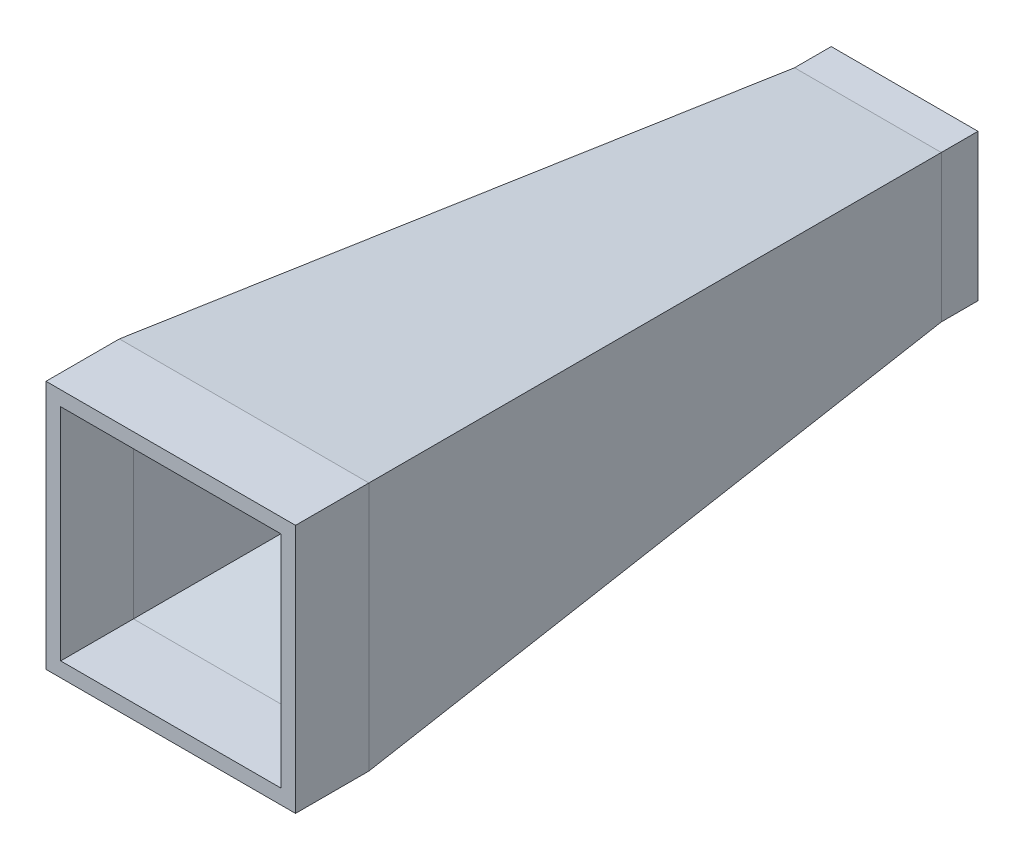
ISO-10303-21;
HEADER;
FILE_DESCRIPTION(('STEP AP214'),'2;1');
FILE_NAME('part.step','',(''),(''),'','','');
FILE_SCHEMA(('AUTOMOTIVE_DESIGN { 1 0 10303 214 1 1 1 1 }'));
ENDSEC;
DATA;
#1=APPLICATION_CONTEXT('core data for automotive mechanical design processes');
#2=APPLICATION_PROTOCOL_DEFINITION('international standard','automotive_design',2000,#1);
#3=PRODUCT_CONTEXT('',#1,'mechanical');
#4=PRODUCT('Part','Part','',(#3));
#5=PRODUCT_RELATED_PRODUCT_CATEGORY('part','',(#4));
#6=PRODUCT_DEFINITION_FORMATION('','',#4);
#7=PRODUCT_DEFINITION_CONTEXT('part definition',#1,'design');
#8=PRODUCT_DEFINITION('design','',#6,#7);
#9=PRODUCT_DEFINITION_SHAPE('','',#8);
#10=(LENGTH_UNIT() NAMED_UNIT(*) SI_UNIT(.MILLI.,.METRE.));
#11=(NAMED_UNIT(*) PLANE_ANGLE_UNIT() SI_UNIT($,.RADIAN.));
#12=(NAMED_UNIT(*) SI_UNIT($,.STERADIAN.) SOLID_ANGLE_UNIT());
#13=UNCERTAINTY_MEASURE_WITH_UNIT(LENGTH_MEASURE(1.E-05),#10,'distance_accuracy_value','');
#14=(GEOMETRIC_REPRESENTATION_CONTEXT(3) GLOBAL_UNCERTAINTY_ASSIGNED_CONTEXT((#13)) GLOBAL_UNIT_ASSIGNED_CONTEXT((#10,
#11,#12)) REPRESENTATION_CONTEXT('',''));
#15=CARTESIAN_POINT('',(0.,0.,0.));
#16=DIRECTION('',(0.,0.,1.));
#17=DIRECTION('',(1.,0.,0.));
#18=AXIS2_PLACEMENT_3D('',#15,#16,#17);
#19=CARTESIAN_POINT('',(0.,0.,50.));
#20=DIRECTION('',(0.,0.,-1.));
#21=DIRECTION('',(-1.,0.,0.));
#22=AXIS2_PLACEMENT_3D('',#19,#20,#21);
#23=PLANE('',#22);
#24=DIRECTION('',(0.,1.,0.));
#25=VECTOR('',#24,1.);
#26=CARTESIAN_POINT('',(85.,-85.,50.));
#27=LINE('',#26,#25);
#28=CARTESIAN_POINT('',(85.,-85.,50.));
#29=VERTEX_POINT('',#28);
#30=CARTESIAN_POINT('',(85.,85.,50.));
#31=VERTEX_POINT('',#30);
#32=EDGE_CURVE('E122',#29,#31,#27,.T.);
#33=ORIENTED_EDGE('',*,*,#32,.T.);
#34=DIRECTION('',(-1.,0.,0.));
#35=VECTOR('',#34,1.);
#36=CARTESIAN_POINT('',(-85.,85.,50.));
#37=LINE('',#36,#35);
#38=CARTESIAN_POINT('',(-85.,85.,50.));
#39=VERTEX_POINT('',#38);
#40=EDGE_CURVE('E115',#31,#39,#37,.T.);
#41=ORIENTED_EDGE('',*,*,#40,.T.);
#42=DIRECTION('',(0.,-1.,0.));
#43=VECTOR('',#42,1.);
#44=CARTESIAN_POINT('',(-85.,-85.,50.));
#45=LINE('',#44,#43);
#46=CARTESIAN_POINT('',(-85.,-85.,50.));
#47=VERTEX_POINT('',#46);
#48=EDGE_CURVE('E119',#39,#47,#45,.T.);
#49=ORIENTED_EDGE('',*,*,#48,.T.);
#50=DIRECTION('',(1.,0.,0.));
#51=VECTOR('',#50,1.);
#52=CARTESIAN_POINT('',(-85.,-85.,50.));
#53=LINE('',#52,#51);
#54=EDGE_CURVE('E77',#47,#29,#53,.T.);
#55=ORIENTED_EDGE('',*,*,#54,.T.);
#56=EDGE_LOOP('',(#33,#41,#49,#55));
#57=FACE_BOUND('',#56,.T.);
#58=DIRECTION('',(0.,1.,0.));
#59=VECTOR('',#58,1.);
#60=CARTESIAN_POINT('',(75.,0.,50.));
#61=LINE('',#60,#59);
#62=CARTESIAN_POINT('',(75.,-75.,50.));
#63=VERTEX_POINT('',#62);
#64=CARTESIAN_POINT('',(75.,75.,50.));
#65=VERTEX_POINT('',#64);
#66=EDGE_CURVE('E293',#63,#65,#61,.T.);
#67=ORIENTED_EDGE('',*,*,#66,.F.);
#68=DIRECTION('',(1.,0.,0.));
#69=VECTOR('',#68,1.);
#70=CARTESIAN_POINT('',(0.,-75.,50.));
#71=LINE('',#70,#69);
#72=CARTESIAN_POINT('',(-75.,-75.,50.));
#73=VERTEX_POINT('',#72);
#74=EDGE_CURVE('E283',#73,#63,#71,.T.);
#75=ORIENTED_EDGE('',*,*,#74,.F.);
#76=DIRECTION('',(0.,-1.,0.));
#77=VECTOR('',#76,1.);
#78=CARTESIAN_POINT('',(-75.,0.,50.));
#79=LINE('',#78,#77);
#80=CARTESIAN_POINT('',(-75.,75.,50.));
#81=VERTEX_POINT('',#80);
#82=EDGE_CURVE('E286',#81,#73,#79,.T.);
#83=ORIENTED_EDGE('',*,*,#82,.F.);
#84=DIRECTION('',(-1.,0.,0.));
#85=VECTOR('',#84,1.);
#86=CARTESIAN_POINT('',(0.,75.,50.));
#87=LINE('',#86,#85);
#88=EDGE_CURVE('E289',#65,#81,#87,.T.);
#89=ORIENTED_EDGE('',*,*,#88,.F.);
#90=EDGE_LOOP('',(#67,#75,#83,#89));
#91=FACE_BOUND('',#90,.T.);
#92=ADVANCED_FACE('F49',(#57,#91),#23,.F.);
#93=CARTESIAN_POINT('',(85.,-85.,50.));
#94=DIRECTION('',(-1.,0.,0.));
#95=DIRECTION('',(0.,0.,1.));
#96=AXIS2_PLACEMENT_3D('',#93,#94,#95);
#97=PLANE('',#96);
#98=DIRECTION('',(0.,1.,0.));
#99=VECTOR('',#98,1.);
#100=CARTESIAN_POINT('',(85.,-85.,0.));
#101=LINE('',#100,#99);
#102=CARTESIAN_POINT('',(85.,-85.,0.));
#103=VERTEX_POINT('',#102);
#104=CARTESIAN_POINT('',(85.,85.,0.));
#105=VERTEX_POINT('',#104);
#106=EDGE_CURVE('E98',#103,#105,#101,.T.);
#107=ORIENTED_EDGE('',*,*,#106,.T.);
#108=DIRECTION('',(0.,0.,-1.));
#109=VECTOR('',#108,1.);
#110=CARTESIAN_POINT('',(85.,85.,50.));
#111=LINE('',#110,#109);
#112=EDGE_CURVE('E12',#31,#105,#111,.T.);
#113=ORIENTED_EDGE('',*,*,#112,.F.);
#114=ORIENTED_EDGE('',*,*,#32,.F.);
#115=DIRECTION('',(0.,0.,-1.));
#116=VECTOR('',#115,1.);
#117=CARTESIAN_POINT('',(85.,-85.,50.));
#118=LINE('',#117,#116);
#119=EDGE_CURVE('E142',#29,#103,#118,.T.);
#120=ORIENTED_EDGE('',*,*,#119,.T.);
#121=EDGE_LOOP('',(#107,#113,#114,#120));
#122=FACE_BOUND('',#121,.T.);
#123=ADVANCED_FACE('F51',(#122),#97,.F.);
#124=CARTESIAN_POINT('',(-85.,85.,50.));
#125=DIRECTION('',(0.,-1.,0.));
#126=DIRECTION('',(0.,0.,-1.));
#127=AXIS2_PLACEMENT_3D('',#124,#125,#126);
#128=PLANE('',#127);
#129=DIRECTION('',(1.,0.,0.));
#130=VECTOR('',#129,1.);
#131=CARTESIAN_POINT('',(-85.,85.,0.));
#132=LINE('',#131,#130);
#133=CARTESIAN_POINT('',(-85.,85.,3.05311331771918E-13));
#134=VERTEX_POINT('',#133);
#135=EDGE_CURVE('E131',#105,#134,#132,.F.);
#136=ORIENTED_EDGE('',*,*,#135,.T.);
#137=DIRECTION('',(0.,0.,-1.));
#138=VECTOR('',#137,1.);
#139=CARTESIAN_POINT('',(-85.,85.,50.));
#140=LINE('',#139,#138);
#141=EDGE_CURVE('E60',#39,#134,#140,.T.);
#142=ORIENTED_EDGE('',*,*,#141,.F.);
#143=ORIENTED_EDGE('',*,*,#40,.F.);
#144=ORIENTED_EDGE('',*,*,#112,.T.);
#145=EDGE_LOOP('',(#136,#142,#143,#144));
#146=FACE_BOUND('',#145,.T.);
#147=ADVANCED_FACE('F129',(#146),#128,.F.);
#148=CARTESIAN_POINT('',(-85.,-85.,50.));
#149=DIRECTION('',(1.,0.,0.));
#150=DIRECTION('',(0.,0.,-1.));
#151=AXIS2_PLACEMENT_3D('',#148,#149,#150);
#152=PLANE('',#151);
#153=DIRECTION('',(0.,1.,0.));
#154=VECTOR('',#153,1.);
#155=CARTESIAN_POINT('',(-85.,-85.,0.));
#156=LINE('',#155,#154);
#157=CARTESIAN_POINT('',(-85.,-85.,3.05311331771918E-13));
#158=VERTEX_POINT('',#157);
#159=EDGE_CURVE('E156',#134,#158,#156,.F.);
#160=ORIENTED_EDGE('',*,*,#159,.T.);
#161=DIRECTION('',(0.,0.,-1.));
#162=VECTOR('',#161,1.);
#163=CARTESIAN_POINT('',(-85.,-85.,50.));
#164=LINE('',#163,#162);
#165=EDGE_CURVE('E135',#47,#158,#164,.T.);
#166=ORIENTED_EDGE('',*,*,#165,.F.);
#167=ORIENTED_EDGE('',*,*,#48,.F.);
#168=ORIENTED_EDGE('',*,*,#141,.T.);
#169=EDGE_LOOP('',(#160,#166,#167,#168));
#170=FACE_BOUND('',#169,.T.);
#171=ADVANCED_FACE('F137',(#170),#152,.F.);
#172=CARTESIAN_POINT('',(-85.,-85.,50.));
#173=DIRECTION('',(0.,1.,0.));
#174=DIRECTION('',(0.,0.,1.));
#175=AXIS2_PLACEMENT_3D('',#172,#173,#174);
#176=PLANE('',#175);
#177=DIRECTION('',(1.,0.,0.));
#178=VECTOR('',#177,1.);
#179=CARTESIAN_POINT('',(-85.,-85.,0.));
#180=LINE('',#179,#178);
#181=EDGE_CURVE('E159',#158,#103,#180,.T.);
#182=ORIENTED_EDGE('',*,*,#181,.T.);
#183=ORIENTED_EDGE('',*,*,#119,.F.);
#184=ORIENTED_EDGE('',*,*,#54,.F.);
#185=ORIENTED_EDGE('',*,*,#165,.T.);
#186=EDGE_LOOP('',(#182,#183,#184,#185));
#187=FACE_BOUND('',#186,.T.);
#188=ADVANCED_FACE('F400',(#187),#176,.F.);
#189=CARTESIAN_POINT('',(0.,84.427412702777,-6.9528457519934));
#190=DIRECTION('',(0.,-0.996626147989405,0.082075094540304));
#191=DIRECTION('',(0.,-0.082075094540304,-0.996626147989405));
#192=AXIS2_PLACEMENT_3D('',#189,#190,#191);
#193=PLANE('',#192);
#194=DIRECTION('',(-0.0818000413006843,0.0818000413006844,0.993286215794024));
#195=VECTOR('',#194,1.);
#196=CARTESIAN_POINT('',(-50.,50.,-425.));
#197=LINE('',#196,#195);
#198=CARTESIAN_POINT('',(-50.,50.,-425.));
#199=VERTEX_POINT('',#198);
#200=EDGE_CURVE('E106',#199,#134,#197,.T.);
#201=ORIENTED_EDGE('',*,*,#200,.T.);
#202=ORIENTED_EDGE('',*,*,#135,.F.);
#203=DIRECTION('',(0.0818000413006844,0.0818000413006844,0.993286215794024));
#204=VECTOR('',#203,1.);
#205=CARTESIAN_POINT('',(50.,50.,-425.));
#206=LINE('',#205,#204);
#207=CARTESIAN_POINT('',(50.,50.,-425.));
#208=VERTEX_POINT('',#207);
#209=EDGE_CURVE('E234',#208,#105,#206,.T.);
#210=ORIENTED_EDGE('',*,*,#209,.F.);
#211=DIRECTION('',(1.,0.,0.));
#212=VECTOR('',#211,1.);
#213=CARTESIAN_POINT('',(50.,50.,-425.));
#214=LINE('',#213,#212);
#215=EDGE_CURVE('E220',#199,#208,#214,.T.);
#216=ORIENTED_EDGE('',*,*,#215,.F.);
#217=EDGE_LOOP('',(#201,#202,#210,#216));
#218=FACE_BOUND('',#217,.T.);
#219=ADVANCED_FACE('F390',(#218),#193,.F.);
#220=CARTESIAN_POINT('',(84.427412702777,0.,-6.95284575199341));
#221=DIRECTION('',(-0.996626147989405,0.,0.082075094540304));
#222=DIRECTION('',(0.082075094540304,0.,0.996626147989405));
#223=AXIS2_PLACEMENT_3D('',#220,#221,#222);
#224=PLANE('',#223);
#225=ORIENTED_EDGE('',*,*,#209,.T.);
#226=ORIENTED_EDGE('',*,*,#106,.F.);
#227=DIRECTION('',(0.0818000413006844,-0.0818000413006844,0.993286215794024));
#228=VECTOR('',#227,1.);
#229=CARTESIAN_POINT('',(50.,-50.,-425.));
#230=LINE('',#229,#228);
#231=CARTESIAN_POINT('',(50.,-50.,-425.));
#232=VERTEX_POINT('',#231);
#233=EDGE_CURVE('E153',#232,#103,#230,.T.);
#234=ORIENTED_EDGE('',*,*,#233,.F.);
#235=DIRECTION('',(0.,-1.,0.));
#236=VECTOR('',#235,1.);
#237=CARTESIAN_POINT('',(50.,-50.,-425.));
#238=LINE('',#237,#236);
#239=EDGE_CURVE('E211',#208,#232,#238,.T.);
#240=ORIENTED_EDGE('',*,*,#239,.F.);
#241=EDGE_LOOP('',(#225,#226,#234,#240));
#242=FACE_BOUND('',#241,.T.);
#243=ADVANCED_FACE('F399',(#242),#224,.F.);
#244=CARTESIAN_POINT('',(-84.427412702777,0.,-6.9528457519934));
#245=DIRECTION('',(0.996626147989405,0.,0.0820750945403039));
#246=DIRECTION('',(0.0820750945403039,0.,-0.996626147989405));
#247=AXIS2_PLACEMENT_3D('',#244,#245,#246);
#248=PLANE('',#247);
#249=DIRECTION('',(-0.0818000413006843,-0.0818000413006844,0.993286215794024));
#250=VECTOR('',#249,1.);
#251=CARTESIAN_POINT('',(-50.,-50.,-425.));
#252=LINE('',#251,#250);
#253=CARTESIAN_POINT('',(-50.,-50.,-425.));
#254=VERTEX_POINT('',#253);
#255=EDGE_CURVE('E230',#254,#158,#252,.T.);
#256=ORIENTED_EDGE('',*,*,#255,.T.);
#257=ORIENTED_EDGE('',*,*,#159,.F.);
#258=ORIENTED_EDGE('',*,*,#200,.F.);
#259=DIRECTION('',(0.,1.,0.));
#260=VECTOR('',#259,1.);
#261=CARTESIAN_POINT('',(-50.,-50.,-425.));
#262=LINE('',#261,#260);
#263=EDGE_CURVE('E53',#254,#199,#262,.T.);
#264=ORIENTED_EDGE('',*,*,#263,.F.);
#265=EDGE_LOOP('',(#256,#257,#258,#264));
#266=FACE_BOUND('',#265,.T.);
#267=ADVANCED_FACE('F405',(#266),#248,.F.);
#268=CARTESIAN_POINT('',(0.,-84.427412702777,-6.9528457519934));
#269=DIRECTION('',(0.,0.996626147989405,0.082075094540304));
#270=DIRECTION('',(0.,-0.082075094540304,0.996626147989405));
#271=AXIS2_PLACEMENT_3D('',#268,#269,#270);
#272=PLANE('',#271);
#273=ORIENTED_EDGE('',*,*,#233,.T.);
#274=ORIENTED_EDGE('',*,*,#181,.F.);
#275=ORIENTED_EDGE('',*,*,#255,.F.);
#276=DIRECTION('',(-1.,0.,0.));
#277=VECTOR('',#276,1.);
#278=CARTESIAN_POINT('',(50.,-50.,-425.));
#279=LINE('',#278,#277);
#280=EDGE_CURVE('E176',#232,#254,#279,.T.);
#281=ORIENTED_EDGE('',*,*,#280,.F.);
#282=EDGE_LOOP('',(#273,#274,#275,#281));
#283=FACE_BOUND('',#282,.T.);
#284=ADVANCED_FACE('F459',(#283),#272,.F.);
#285=CARTESIAN_POINT('',(-50.,-50.,-425.));
#286=DIRECTION('',(-1.,0.,0.));
#287=DIRECTION('',(0.,0.,1.));
#288=AXIS2_PLACEMENT_3D('',#285,#286,#287);
#289=PLANE('',#288);
#290=DIRECTION('',(0.,1.,0.));
#291=VECTOR('',#290,1.);
#292=CARTESIAN_POINT('',(-50.,-50.,-450.));
#293=LINE('',#292,#291);
#294=CARTESIAN_POINT('',(-50.,-50.,-450.));
#295=VERTEX_POINT('',#294);
#296=CARTESIAN_POINT('',(-50.,50.,-450.));
#297=VERTEX_POINT('',#296);
#298=EDGE_CURVE('E265',#295,#297,#293,.T.);
#299=ORIENTED_EDGE('',*,*,#298,.F.);
#300=DIRECTION('',(0.,0.,-1.));
#301=VECTOR('',#300,1.);
#302=CARTESIAN_POINT('',(-50.,-50.,-425.));
#303=LINE('',#302,#301);
#304=EDGE_CURVE('E163',#254,#295,#303,.T.);
#305=ORIENTED_EDGE('',*,*,#304,.F.);
#306=ORIENTED_EDGE('',*,*,#263,.T.);
#307=DIRECTION('',(0.,0.,-1.));
#308=VECTOR('',#307,1.);
#309=CARTESIAN_POINT('',(-50.,50.,-425.));
#310=LINE('',#309,#308);
#311=EDGE_CURVE('E250',#199,#297,#310,.T.);
#312=ORIENTED_EDGE('',*,*,#311,.T.);
#313=EDGE_LOOP('',(#299,#305,#306,#312));
#314=FACE_BOUND('',#313,.T.);
#315=ADVANCED_FACE('F194',(#314),#289,.T.);
#316=CARTESIAN_POINT('',(50.,-50.,-425.));
#317=DIRECTION('',(0.,-1.,0.));
#318=DIRECTION('',(0.,0.,-1.));
#319=AXIS2_PLACEMENT_3D('',#316,#317,#318);
#320=PLANE('',#319);
#321=DIRECTION('',(-1.,0.,0.));
#322=VECTOR('',#321,1.);
#323=CARTESIAN_POINT('',(50.,-50.,-450.));
#324=LINE('',#323,#322);
#325=CARTESIAN_POINT('',(50.,-50.,-450.));
#326=VERTEX_POINT('',#325);
#327=EDGE_CURVE('E253',#326,#295,#324,.T.);
#328=ORIENTED_EDGE('',*,*,#327,.F.);
#329=DIRECTION('',(0.,0.,-1.));
#330=VECTOR('',#329,1.);
#331=CARTESIAN_POINT('',(50.,-50.,-425.));
#332=LINE('',#331,#330);
#333=EDGE_CURVE('E167',#232,#326,#332,.T.);
#334=ORIENTED_EDGE('',*,*,#333,.F.);
#335=ORIENTED_EDGE('',*,*,#280,.T.);
#336=ORIENTED_EDGE('',*,*,#304,.T.);
#337=EDGE_LOOP('',(#328,#334,#335,#336));
#338=FACE_BOUND('',#337,.T.);
#339=ADVANCED_FACE('F183',(#338),#320,.T.);
#340=CARTESIAN_POINT('',(50.,-50.,-425.));
#341=DIRECTION('',(1.,0.,0.));
#342=DIRECTION('',(0.,0.,-1.));
#343=AXIS2_PLACEMENT_3D('',#340,#341,#342);
#344=PLANE('',#343);
#345=DIRECTION('',(0.,-1.,0.));
#346=VECTOR('',#345,1.);
#347=CARTESIAN_POINT('',(50.,-50.,-450.));
#348=LINE('',#347,#346);
#349=CARTESIAN_POINT('',(50.,50.,-450.));
#350=VERTEX_POINT('',#349);
#351=EDGE_CURVE('E257',#350,#326,#348,.T.);
#352=ORIENTED_EDGE('',*,*,#351,.F.);
#353=DIRECTION('',(0.,0.,-1.));
#354=VECTOR('',#353,1.);
#355=CARTESIAN_POINT('',(50.,50.,-425.));
#356=LINE('',#355,#354);
#357=EDGE_CURVE('E221',#208,#350,#356,.T.);
#358=ORIENTED_EDGE('',*,*,#357,.F.);
#359=ORIENTED_EDGE('',*,*,#239,.T.);
#360=ORIENTED_EDGE('',*,*,#333,.T.);
#361=EDGE_LOOP('',(#352,#358,#359,#360));
#362=FACE_BOUND('',#361,.T.);
#363=ADVANCED_FACE('F193',(#362),#344,.T.);
#364=CARTESIAN_POINT('',(50.,50.,-425.));
#365=DIRECTION('',(0.,1.,0.));
#366=DIRECTION('',(0.,0.,1.));
#367=AXIS2_PLACEMENT_3D('',#364,#365,#366);
#368=PLANE('',#367);
#369=DIRECTION('',(1.,0.,0.));
#370=VECTOR('',#369,1.);
#371=CARTESIAN_POINT('',(50.,50.,-450.));
#372=LINE('',#371,#370);
#373=EDGE_CURVE('E261',#297,#350,#372,.T.);
#374=ORIENTED_EDGE('',*,*,#373,.F.);
#375=ORIENTED_EDGE('',*,*,#311,.F.);
#376=ORIENTED_EDGE('',*,*,#215,.T.);
#377=ORIENTED_EDGE('',*,*,#357,.T.);
#378=EDGE_LOOP('',(#374,#375,#376,#377));
#379=FACE_BOUND('',#378,.T.);
#380=ADVANCED_FACE('F200',(#379),#368,.T.);
#381=CARTESIAN_POINT('',(0.,0.,-450.));
#382=DIRECTION('',(0.,0.,1.));
#383=DIRECTION('',(1.,0.,0.));
#384=AXIS2_PLACEMENT_3D('',#381,#382,#383);
#385=PLANE('',#384);
#386=ORIENTED_EDGE('',*,*,#298,.T.);
#387=ORIENTED_EDGE('',*,*,#373,.T.);
#388=ORIENTED_EDGE('',*,*,#351,.T.);
#389=ORIENTED_EDGE('',*,*,#327,.T.);
#390=EDGE_LOOP('',(#386,#387,#388,#389));
#391=FACE_BOUND('',#390,.T.);
#392=ADVANCED_FACE('F195',(#391),#385,.F.);
#393=CARTESIAN_POINT('',(75.,-85.,50.));
#394=DIRECTION('',(-1.,0.,0.));
#395=DIRECTION('',(0.,0.,1.));
#396=AXIS2_PLACEMENT_3D('',#393,#394,#395);
#397=PLANE('',#396);
#398=DIRECTION('',(0.,1.,0.));
#399=VECTOR('',#398,1.);
#400=CARTESIAN_POINT('',(75.,-85.,0.411068915545182));
#401=LINE('',#400,#399);
#402=CARTESIAN_POINT('',(75.,-75.,0.411068915545161));
#403=VERTEX_POINT('',#402);
#404=CARTESIAN_POINT('',(75.,75.,0.411068915545157));
#405=VERTEX_POINT('',#404);
#406=EDGE_CURVE('E309',#403,#405,#401,.T.);
#407=ORIENTED_EDGE('',*,*,#406,.F.);
#408=DIRECTION('',(0.,0.,-1.));
#409=VECTOR('',#408,1.);
#410=CARTESIAN_POINT('',(75.,-75.,50.));
#411=LINE('',#410,#409);
#412=EDGE_CURVE('E279',#63,#403,#411,.T.);
#413=ORIENTED_EDGE('',*,*,#412,.F.);
#414=ORIENTED_EDGE('',*,*,#66,.T.);
#415=DIRECTION('',(0.,0.,-1.));
#416=VECTOR('',#415,1.);
#417=CARTESIAN_POINT('',(75.,75.,50.));
#418=LINE('',#417,#416);
#419=EDGE_CURVE('E269',#65,#405,#418,.T.);
#420=ORIENTED_EDGE('',*,*,#419,.T.);
#421=EDGE_LOOP('',(#407,#413,#414,#420));
#422=FACE_BOUND('',#421,.T.);
#423=ADVANCED_FACE('F529',(#422),#397,.T.);
#424=CARTESIAN_POINT('',(-85.,75.,50.));
#425=DIRECTION('',(0.,-1.,0.));
#426=DIRECTION('',(0.,0.,-1.));
#427=AXIS2_PLACEMENT_3D('',#424,#425,#426);
#428=PLANE('',#427);
#429=DIRECTION('',(-1.,0.,0.));
#430=VECTOR('',#429,1.);
#431=CARTESIAN_POINT('',(-85.,75.,0.411068915545203));
#432=LINE('',#431,#430);
#433=CARTESIAN_POINT('',(-75.,75.,0.411068915545169));
#434=VERTEX_POINT('',#433);
#435=EDGE_CURVE('E305',#405,#434,#432,.T.);
#436=ORIENTED_EDGE('',*,*,#435,.F.);
#437=ORIENTED_EDGE('',*,*,#419,.F.);
#438=ORIENTED_EDGE('',*,*,#88,.T.);
#439=DIRECTION('',(0.,0.,-1.));
#440=VECTOR('',#439,1.);
#441=CARTESIAN_POINT('',(-75.,75.,50.));
#442=LINE('',#441,#440);
#443=EDGE_CURVE('E273',#81,#434,#442,.T.);
#444=ORIENTED_EDGE('',*,*,#443,.T.);
#445=EDGE_LOOP('',(#436,#437,#438,#444));
#446=FACE_BOUND('',#445,.T.);
#447=ADVANCED_FACE('F545',(#446),#428,.T.);
#448=CARTESIAN_POINT('',(-75.,-85.,50.));
#449=DIRECTION('',(1.,0.,0.));
#450=DIRECTION('',(0.,0.,-1.));
#451=AXIS2_PLACEMENT_3D('',#448,#449,#450);
#452=PLANE('',#451);
#453=DIRECTION('',(0.,-1.,0.));
#454=VECTOR('',#453,1.);
#455=CARTESIAN_POINT('',(-75.,-85.,0.41106891554521));
#456=LINE('',#455,#454);
#457=CARTESIAN_POINT('',(-75.,-75.,0.411068915545172));
#458=VERTEX_POINT('',#457);
#459=EDGE_CURVE('E301',#434,#458,#456,.T.);
#460=ORIENTED_EDGE('',*,*,#459,.F.);
#461=ORIENTED_EDGE('',*,*,#443,.F.);
#462=ORIENTED_EDGE('',*,*,#82,.T.);
#463=DIRECTION('',(0.,0.,-1.));
#464=VECTOR('',#463,1.);
#465=CARTESIAN_POINT('',(-75.,-75.,50.));
#466=LINE('',#465,#464);
#467=EDGE_CURVE('E68',#73,#458,#466,.T.);
#468=ORIENTED_EDGE('',*,*,#467,.T.);
#469=EDGE_LOOP('',(#460,#461,#462,#468));
#470=FACE_BOUND('',#469,.T.);
#471=ADVANCED_FACE('F569',(#470),#452,.T.);
#472=CARTESIAN_POINT('',(-85.,-75.,50.));
#473=DIRECTION('',(0.,1.,0.));
#474=DIRECTION('',(0.,0.,1.));
#475=AXIS2_PLACEMENT_3D('',#472,#473,#474);
#476=PLANE('',#475);
#477=DIRECTION('',(1.,0.,0.));
#478=VECTOR('',#477,1.);
#479=CARTESIAN_POINT('',(-85.,-75.,0.411068915545203));
#480=LINE('',#479,#478);
#481=EDGE_CURVE('E297',#458,#403,#480,.T.);
#482=ORIENTED_EDGE('',*,*,#481,.F.);
#483=ORIENTED_EDGE('',*,*,#467,.F.);
#484=ORIENTED_EDGE('',*,*,#74,.T.);
#485=ORIENTED_EDGE('',*,*,#412,.T.);
#486=EDGE_LOOP('',(#482,#483,#484,#485));
#487=FACE_BOUND('',#486,.T.);
#488=ADVANCED_FACE('F539',(#487),#476,.T.);
#489=CARTESIAN_POINT('',(0.,74.461151222883,-6.13209480659036));
#490=DIRECTION('',(0.,-0.996626147989405,0.082075094540304));
#491=DIRECTION('',(0.,-0.082075094540304,-0.996626147989405));
#492=AXIS2_PLACEMENT_3D('',#489,#490,#491);
#493=PLANE('',#492);
#494=DIRECTION('',(-0.0818000413006843,0.0818000413006844,0.993286215794024));
#495=VECTOR('',#494,1.);
#496=CARTESIAN_POINT('',(-73.9629132862557,73.9629132862557,-12.1821268942068));
#497=LINE('',#496,#495);
#498=CARTESIAN_POINT('',(-40.,40.,-424.588931084455));
#499=VERTEX_POINT('',#498);
#500=EDGE_CURVE('E325',#499,#434,#497,.T.);
#501=ORIENTED_EDGE('',*,*,#500,.F.);
#502=DIRECTION('',(1.,0.,0.));
#503=VECTOR('',#502,1.);
#504=CARTESIAN_POINT('',(50.,40.,-424.588931084455));
#505=LINE('',#504,#503);
#506=CARTESIAN_POINT('',(40.,40.,-424.588931084455));
#507=VERTEX_POINT('',#506);
#508=EDGE_CURVE('E329',#499,#507,#505,.T.);
#509=ORIENTED_EDGE('',*,*,#508,.T.);
#510=DIRECTION('',(0.0818000413006844,0.0818000413006844,0.993286215794024));
#511=VECTOR('',#510,1.);
#512=CARTESIAN_POINT('',(73.9629132862557,73.9629132862557,-12.1821268942068));
#513=LINE('',#512,#511);
#514=EDGE_CURVE('E321',#507,#405,#513,.T.);
#515=ORIENTED_EDGE('',*,*,#514,.T.);
#516=ORIENTED_EDGE('',*,*,#435,.T.);
#517=EDGE_LOOP('',(#501,#509,#515,#516));
#518=FACE_BOUND('',#517,.T.);
#519=ADVANCED_FACE('F548',(#518),#493,.T.);
#520=CARTESIAN_POINT('',(74.461151222883,0.,-6.13209480659037));
#521=DIRECTION('',(-0.996626147989405,0.,0.082075094540304));
#522=DIRECTION('',(0.082075094540304,0.,0.996626147989405));
#523=AXIS2_PLACEMENT_3D('',#520,#521,#522);
#524=PLANE('',#523);
#525=ORIENTED_EDGE('',*,*,#514,.F.);
#526=DIRECTION('',(0.,-1.,0.));
#527=VECTOR('',#526,1.);
#528=CARTESIAN_POINT('',(40.,-50.,-424.588931084455));
#529=LINE('',#528,#527);
#530=CARTESIAN_POINT('',(40.,-40.,-424.588931084455));
#531=VERTEX_POINT('',#530);
#532=EDGE_CURVE('E333',#507,#531,#529,.T.);
#533=ORIENTED_EDGE('',*,*,#532,.T.);
#534=DIRECTION('',(0.0818000413006844,-0.0818000413006844,0.993286215794024));
#535=VECTOR('',#534,1.);
#536=CARTESIAN_POINT('',(73.9629132862557,-73.9629132862557,-12.1821268942068));
#537=LINE('',#536,#535);
#538=EDGE_CURVE('E313',#531,#403,#537,.T.);
#539=ORIENTED_EDGE('',*,*,#538,.T.);
#540=ORIENTED_EDGE('',*,*,#406,.T.);
#541=EDGE_LOOP('',(#525,#533,#539,#540));
#542=FACE_BOUND('',#541,.T.);
#543=ADVANCED_FACE('F535',(#542),#524,.T.);
#544=CARTESIAN_POINT('',(-74.4611512228829,0.,-6.13209480659036));
#545=DIRECTION('',(0.996626147989405,0.,0.0820750945403039));
#546=DIRECTION('',(0.0820750945403039,0.,-0.996626147989405));
#547=AXIS2_PLACEMENT_3D('',#544,#545,#546);
#548=PLANE('',#547);
#549=DIRECTION('',(-0.0818000413006843,-0.0818000413006844,0.993286215794024));
#550=VECTOR('',#549,1.);
#551=CARTESIAN_POINT('',(-73.9629132862557,-73.9629132862557,-12.1821268942068));
#552=LINE('',#551,#550);
#553=CARTESIAN_POINT('',(-40.,-40.,-424.588931084455));
#554=VERTEX_POINT('',#553);
#555=EDGE_CURVE('E317',#554,#458,#552,.T.);
#556=ORIENTED_EDGE('',*,*,#555,.F.);
#557=DIRECTION('',(0.,1.,0.));
#558=VECTOR('',#557,1.);
#559=CARTESIAN_POINT('',(-40.,-50.,-424.588931084455));
#560=LINE('',#559,#558);
#561=EDGE_CURVE('E341',#554,#499,#560,.T.);
#562=ORIENTED_EDGE('',*,*,#561,.T.);
#563=ORIENTED_EDGE('',*,*,#500,.T.);
#564=ORIENTED_EDGE('',*,*,#459,.T.);
#565=EDGE_LOOP('',(#556,#562,#563,#564));
#566=FACE_BOUND('',#565,.T.);
#567=ADVANCED_FACE('F566',(#566),#548,.T.);
#568=CARTESIAN_POINT('',(0.,-74.461151222883,-6.13209480659036));
#569=DIRECTION('',(0.,0.996626147989405,0.082075094540304));
#570=DIRECTION('',(0.,-0.082075094540304,0.996626147989405));
#571=AXIS2_PLACEMENT_3D('',#568,#569,#570);
#572=PLANE('',#571);
#573=ORIENTED_EDGE('',*,*,#538,.F.);
#574=DIRECTION('',(-1.,0.,0.));
#575=VECTOR('',#574,1.);
#576=CARTESIAN_POINT('',(50.,-40.,-424.588931084455));
#577=LINE('',#576,#575);
#578=EDGE_CURVE('E337',#531,#554,#577,.T.);
#579=ORIENTED_EDGE('',*,*,#578,.T.);
#580=ORIENTED_EDGE('',*,*,#555,.T.);
#581=ORIENTED_EDGE('',*,*,#481,.T.);
#582=EDGE_LOOP('',(#573,#579,#580,#581));
#583=FACE_BOUND('',#582,.T.);
#584=ADVANCED_FACE('F538',(#583),#572,.T.);
#585=CARTESIAN_POINT('',(-40.,-50.,-425.));
#586=DIRECTION('',(-1.,0.,0.));
#587=DIRECTION('',(0.,0.,1.));
#588=AXIS2_PLACEMENT_3D('',#585,#586,#587);
#589=PLANE('',#588);
#590=DIRECTION('',(0.,1.,0.));
#591=VECTOR('',#590,1.);
#592=CARTESIAN_POINT('',(-40.,-50.,-440.));
#593=LINE('',#592,#591);
#594=CARTESIAN_POINT('',(-40.,-40.,-440.));
#595=VERTEX_POINT('',#594);
#596=CARTESIAN_POINT('',(-40.,40.,-440.));
#597=VERTEX_POINT('',#596);
#598=EDGE_CURVE('E373',#595,#597,#593,.T.);
#599=ORIENTED_EDGE('',*,*,#598,.T.);
#600=DIRECTION('',(0.,0.,-1.));
#601=VECTOR('',#600,1.);
#602=CARTESIAN_POINT('',(-40.,40.,-425.));
#603=LINE('',#602,#601);
#604=EDGE_CURVE('E357',#499,#597,#603,.T.);
#605=ORIENTED_EDGE('',*,*,#604,.F.);
#606=ORIENTED_EDGE('',*,*,#561,.F.);
#607=DIRECTION('',(0.,0.,-1.));
#608=VECTOR('',#607,1.);
#609=CARTESIAN_POINT('',(-40.,-40.,-425.));
#610=LINE('',#609,#608);
#611=EDGE_CURVE('E345',#554,#595,#610,.T.);
#612=ORIENTED_EDGE('',*,*,#611,.T.);
#613=EDGE_LOOP('',(#599,#605,#606,#612));
#614=FACE_BOUND('',#613,.T.);
#615=ADVANCED_FACE('F564',(#614),#589,.F.);
#616=CARTESIAN_POINT('',(50.,-40.,-425.));
#617=DIRECTION('',(0.,-1.,0.));
#618=DIRECTION('',(0.,0.,-1.));
#619=AXIS2_PLACEMENT_3D('',#616,#617,#618);
#620=PLANE('',#619);
#621=DIRECTION('',(-1.,0.,0.));
#622=VECTOR('',#621,1.);
#623=CARTESIAN_POINT('',(50.,-40.,-440.));
#624=LINE('',#623,#622);
#625=CARTESIAN_POINT('',(40.,-40.,-440.));
#626=VERTEX_POINT('',#625);
#627=EDGE_CURVE('E361',#626,#595,#624,.T.);
#628=ORIENTED_EDGE('',*,*,#627,.T.);
#629=ORIENTED_EDGE('',*,*,#611,.F.);
#630=ORIENTED_EDGE('',*,*,#578,.F.);
#631=DIRECTION('',(0.,0.,-1.));
#632=VECTOR('',#631,1.);
#633=CARTESIAN_POINT('',(40.,-40.,-425.));
#634=LINE('',#633,#632);
#635=EDGE_CURVE('E349',#531,#626,#634,.T.);
#636=ORIENTED_EDGE('',*,*,#635,.T.);
#637=EDGE_LOOP('',(#628,#629,#630,#636));
#638=FACE_BOUND('',#637,.T.);
#639=ADVANCED_FACE('F562',(#638),#620,.F.);
#640=CARTESIAN_POINT('',(40.,-50.,-425.));
#641=DIRECTION('',(1.,0.,0.));
#642=DIRECTION('',(0.,0.,-1.));
#643=AXIS2_PLACEMENT_3D('',#640,#641,#642);
#644=PLANE('',#643);
#645=DIRECTION('',(0.,-1.,0.));
#646=VECTOR('',#645,1.);
#647=CARTESIAN_POINT('',(40.,-50.,-440.));
#648=LINE('',#647,#646);
#649=CARTESIAN_POINT('',(40.,40.,-440.));
#650=VERTEX_POINT('',#649);
#651=EDGE_CURVE('E365',#650,#626,#648,.T.);
#652=ORIENTED_EDGE('',*,*,#651,.T.);
#653=ORIENTED_EDGE('',*,*,#635,.F.);
#654=ORIENTED_EDGE('',*,*,#532,.F.);
#655=DIRECTION('',(0.,0.,-1.));
#656=VECTOR('',#655,1.);
#657=CARTESIAN_POINT('',(40.,40.,-425.));
#658=LINE('',#657,#656);
#659=EDGE_CURVE('E353',#507,#650,#658,.T.);
#660=ORIENTED_EDGE('',*,*,#659,.T.);
#661=EDGE_LOOP('',(#652,#653,#654,#660));
#662=FACE_BOUND('',#661,.T.);
#663=ADVANCED_FACE('F556',(#662),#644,.F.);
#664=CARTESIAN_POINT('',(50.,40.,-425.));
#665=DIRECTION('',(0.,1.,0.));
#666=DIRECTION('',(0.,0.,1.));
#667=AXIS2_PLACEMENT_3D('',#664,#665,#666);
#668=PLANE('',#667);
#669=DIRECTION('',(1.,0.,0.));
#670=VECTOR('',#669,1.);
#671=CARTESIAN_POINT('',(50.,40.,-440.));
#672=LINE('',#671,#670);
#673=EDGE_CURVE('E369',#597,#650,#672,.T.);
#674=ORIENTED_EDGE('',*,*,#673,.T.);
#675=ORIENTED_EDGE('',*,*,#659,.F.);
#676=ORIENTED_EDGE('',*,*,#508,.F.);
#677=ORIENTED_EDGE('',*,*,#604,.T.);
#678=EDGE_LOOP('',(#674,#675,#676,#677));
#679=FACE_BOUND('',#678,.T.);
#680=ADVANCED_FACE('F552',(#679),#668,.F.);
#681=CARTESIAN_POINT('',(0.,0.,-440.));
#682=DIRECTION('',(0.,0.,1.));
#683=DIRECTION('',(1.,0.,0.));
#684=AXIS2_PLACEMENT_3D('',#681,#682,#683);
#685=PLANE('',#684);
#686=ORIENTED_EDGE('',*,*,#598,.F.);
#687=ORIENTED_EDGE('',*,*,#627,.F.);
#688=ORIENTED_EDGE('',*,*,#651,.F.);
#689=ORIENTED_EDGE('',*,*,#673,.F.);
#690=EDGE_LOOP('',(#686,#687,#688,#689));
#691=FACE_BOUND('',#690,.T.);
#692=ADVANCED_FACE('F559',(#691),#685,.T.);
#693=CLOSED_SHELL('',(#92,#123,#147,#171,#188,#219,#243,#267,#284,#315,#339,#363,#380,#392,#423,
#447,#471,#488,#519,#543,#567,#584,#615,#639,#663,#680,#692));
#694=MANIFOLD_SOLID_BREP('B2',#693);
#695=ADVANCED_BREP_SHAPE_REPRESENTATION('',(#18,#694),#14);
#696=SHAPE_DEFINITION_REPRESENTATION(#9,#695);
ENDSEC;
END-ISO-10303-21;
